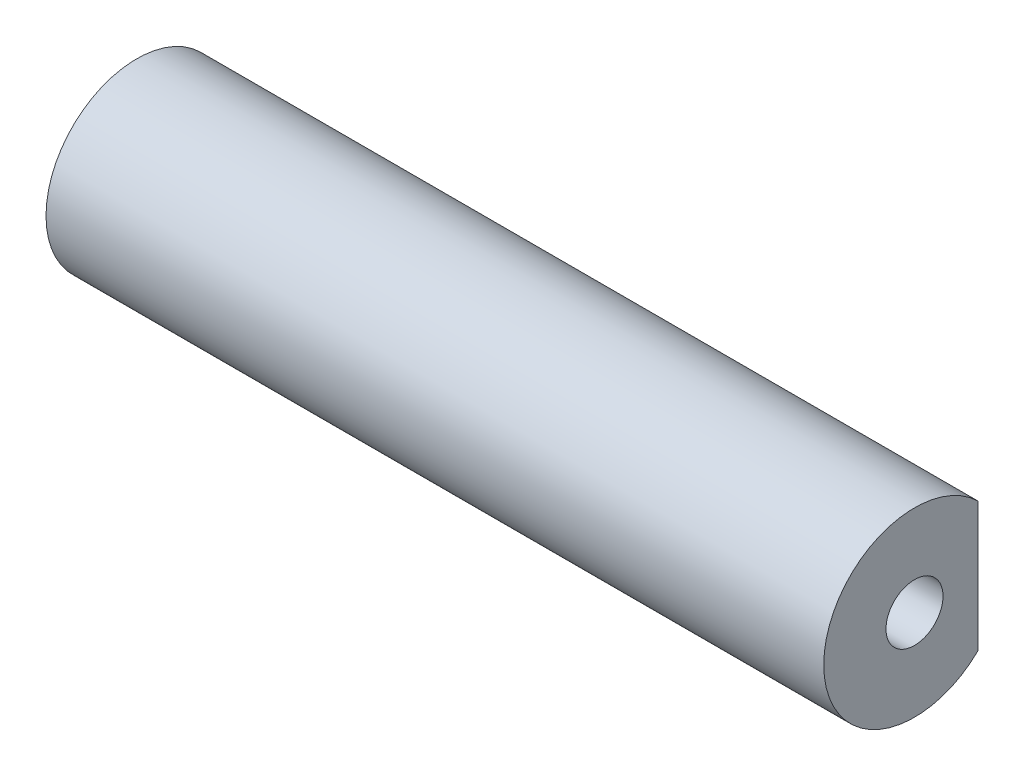
ISO-10303-21;
HEADER;
FILE_DESCRIPTION(('STEP AP214'),'2;1');
FILE_NAME('part.step','',(''),(''),'','','');
FILE_SCHEMA(('AUTOMOTIVE_DESIGN { 1 0 10303 214 1 1 1 1 }'));
ENDSEC;
DATA;
#1=APPLICATION_CONTEXT('core data for automotive mechanical design processes');
#2=APPLICATION_PROTOCOL_DEFINITION('international standard','automotive_design',2000,#1);
#3=PRODUCT_CONTEXT('',#1,'mechanical');
#4=PRODUCT('Part','Part','',(#3));
#5=PRODUCT_RELATED_PRODUCT_CATEGORY('part','',(#4));
#6=PRODUCT_DEFINITION_FORMATION('','',#4);
#7=PRODUCT_DEFINITION_CONTEXT('part definition',#1,'design');
#8=PRODUCT_DEFINITION('design','',#6,#7);
#9=PRODUCT_DEFINITION_SHAPE('','',#8);
#10=(LENGTH_UNIT() NAMED_UNIT(*) SI_UNIT(.MILLI.,.METRE.));
#11=(NAMED_UNIT(*) PLANE_ANGLE_UNIT() SI_UNIT($,.RADIAN.));
#12=(NAMED_UNIT(*) SI_UNIT($,.STERADIAN.) SOLID_ANGLE_UNIT());
#13=UNCERTAINTY_MEASURE_WITH_UNIT(LENGTH_MEASURE(1.E-05),#10,'distance_accuracy_value','');
#14=(GEOMETRIC_REPRESENTATION_CONTEXT(3) GLOBAL_UNCERTAINTY_ASSIGNED_CONTEXT((#13)) GLOBAL_UNIT_ASSIGNED_CONTEXT((#10,
#11,#12)) REPRESENTATION_CONTEXT('',''));
#15=CARTESIAN_POINT('',(0.,0.,0.));
#16=DIRECTION('',(0.,0.,1.));
#17=DIRECTION('',(1.,0.,0.));
#18=AXIS2_PLACEMENT_3D('',#15,#16,#17);
#19=CARTESIAN_POINT('',(30.,0.,0.));
#20=DIRECTION('',(-1.,0.,0.));
#21=DIRECTION('',(0.,0.,1.));
#22=AXIS2_PLACEMENT_3D('',#19,#20,#21);
#23=CYLINDRICAL_SURFACE('',#22,3.5);
#24=CARTESIAN_POINT('',(30.,0.,0.));
#25=DIRECTION('',(1.,0.,0.));
#26=DIRECTION('',(0.,0.,-1.));
#27=AXIS2_PLACEMENT_3D('',#24,#25,#26);
#28=CIRCLE('',#27,3.5);
#29=CARTESIAN_POINT('',(30.,2.5,-2.44948974278318));
#30=VERTEX_POINT('',#29);
#31=CARTESIAN_POINT('',(30.,-2.5,-2.44948974278318));
#32=VERTEX_POINT('',#31);
#33=EDGE_CURVE('E11',#30,#32,#28,.T.);
#34=ORIENTED_EDGE('',*,*,#33,.F.);
#35=DIRECTION('',(1.,0.,0.));
#36=VECTOR('',#35,1.);
#37=CARTESIAN_POINT('',(-5.10916547006629,2.5,-2.44948974278318));
#38=LINE('',#37,#36);
#39=CARTESIAN_POINT('',(0.,2.5,-2.44948974278318));
#40=VERTEX_POINT('',#39);
#41=EDGE_CURVE('E56',#40,#30,#38,.T.);
#42=ORIENTED_EDGE('',*,*,#41,.F.);
#43=CARTESIAN_POINT('',(0.,0.,0.));
#44=DIRECTION('',(1.,0.,0.));
#45=DIRECTION('',(0.,0.,-1.));
#46=AXIS2_PLACEMENT_3D('',#43,#44,#45);
#47=CIRCLE('',#46,3.5);
#48=CARTESIAN_POINT('',(0.,-2.5,-2.44948974278318));
#49=VERTEX_POINT('',#48);
#50=EDGE_CURVE('E36',#40,#49,#47,.T.);
#51=ORIENTED_EDGE('',*,*,#50,.T.);
#52=DIRECTION('',(1.,0.,0.));
#53=VECTOR('',#52,1.);
#54=CARTESIAN_POINT('',(-5.10916547006629,-2.5,-2.44948974278318));
#55=LINE('',#54,#53);
#56=EDGE_CURVE('E47',#49,#32,#55,.T.);
#57=ORIENTED_EDGE('',*,*,#56,.T.);
#58=EDGE_LOOP('',(#34,#42,#51,#57));
#59=FACE_BOUND('',#58,.T.);
#60=ADVANCED_FACE('F33',(#59),#23,.T.);
#61=CARTESIAN_POINT('',(30.,0.,0.));
#62=DIRECTION('',(1.,0.,0.));
#63=DIRECTION('',(0.,0.,-1.));
#64=AXIS2_PLACEMENT_3D('',#61,#62,#63);
#65=PLANE('',#64);
#66=DIRECTION('',(0.,-1.,0.));
#67=VECTOR('',#66,1.);
#68=CARTESIAN_POINT('',(30.,2.5,-2.44948974278318));
#69=LINE('',#68,#67);
#70=EDGE_CURVE('E59',#30,#32,#69,.T.);
#71=ORIENTED_EDGE('',*,*,#70,.F.);
#72=ORIENTED_EDGE('',*,*,#33,.T.);
#73=EDGE_LOOP('',(#71,#72));
#74=FACE_BOUND('',#73,.T.);
#75=CARTESIAN_POINT('',(30.,0.,0.));
#76=DIRECTION('',(1.,0.,0.));
#77=DIRECTION('',(0.,0.,-1.));
#78=AXIS2_PLACEMENT_3D('',#75,#76,#77);
#79=CIRCLE('',#78,1.1);
#80=CARTESIAN_POINT('',(30.,0.,-1.1));
#81=VERTEX_POINT('',#80);
#82=EDGE_CURVE('E70',#81,#81,#79,.T.);
#83=ORIENTED_EDGE('',*,*,#82,.F.);
#84=EDGE_LOOP('',(#83));
#85=FACE_BOUND('',#84,.T.);
#86=ADVANCED_FACE('F66',(#74,#85),#65,.T.);
#87=CARTESIAN_POINT('',(0.,0.,0.));
#88=DIRECTION('',(1.,0.,0.));
#89=DIRECTION('',(0.,0.,-1.));
#90=AXIS2_PLACEMENT_3D('',#87,#88,#89);
#91=PLANE('',#90);
#92=CARTESIAN_POINT('',(0.,0.,0.));
#93=DIRECTION('',(-1.,0.,0.));
#94=DIRECTION('',(0.,0.,1.));
#95=AXIS2_PLACEMENT_3D('',#92,#93,#94);
#96=CIRCLE('',#95,1.2);
#97=CARTESIAN_POINT('',(0.,0.,1.2));
#98=VERTEX_POINT('',#97);
#99=EDGE_CURVE('E76',#98,#98,#96,.T.);
#100=ORIENTED_EDGE('',*,*,#99,.F.);
#101=EDGE_LOOP('',(#100));
#102=FACE_BOUND('',#101,.T.);
#103=ORIENTED_EDGE('',*,*,#50,.F.);
#104=DIRECTION('',(0.,1.,0.));
#105=VECTOR('',#104,1.);
#106=CARTESIAN_POINT('',(0.,2.5,-2.44948974278318));
#107=LINE('',#106,#105);
#108=EDGE_CURVE('E51',#49,#40,#107,.T.);
#109=ORIENTED_EDGE('',*,*,#108,.F.);
#110=EDGE_LOOP('',(#103,#109));
#111=FACE_BOUND('',#110,.T.);
#112=ADVANCED_FACE('F87',(#102,#111),#91,.F.);
#113=CARTESIAN_POINT('',(15.,0.,0.));
#114=DIRECTION('',(-1.,0.,0.));
#115=DIRECTION('',(0.,0.,1.));
#116=AXIS2_PLACEMENT_3D('',#113,#114,#115);
#117=CYLINDRICAL_SURFACE('',#116,1.2);
#118=CARTESIAN_POINT('',(15.,0.,0.));
#119=DIRECTION('',(-1.,0.,0.));
#120=DIRECTION('',(0.,0.,1.));
#121=AXIS2_PLACEMENT_3D('',#118,#119,#120);
#122=CIRCLE('',#121,1.2);
#123=CARTESIAN_POINT('',(15.,0.,1.2));
#124=VERTEX_POINT('',#123);
#125=EDGE_CURVE('E79',#124,#124,#122,.T.);
#126=ORIENTED_EDGE('',*,*,#125,.F.);
#127=EDGE_LOOP('',(#126));
#128=FACE_BOUND('',#127,.T.);
#129=ORIENTED_EDGE('',*,*,#99,.T.);
#130=EDGE_LOOP('',(#129));
#131=FACE_BOUND('',#130,.T.);
#132=ADVANCED_FACE('F85',(#128,#131),#117,.F.);
#133=CARTESIAN_POINT('',(15.,0.,0.));
#134=DIRECTION('',(-1.,0.,0.));
#135=DIRECTION('',(0.,0.,1.));
#136=AXIS2_PLACEMENT_3D('',#133,#134,#135);
#137=PLANE('',#136);
#138=CARTESIAN_POINT('',(15.,0.,0.));
#139=DIRECTION('',(1.,0.,0.));
#140=DIRECTION('',(0.,0.,-1.));
#141=AXIS2_PLACEMENT_3D('',#138,#139,#140);
#142=CIRCLE('',#141,1.1);
#143=CARTESIAN_POINT('',(15.,0.,-1.1));
#144=VERTEX_POINT('',#143);
#145=EDGE_CURVE('E73',#144,#144,#142,.T.);
#146=ORIENTED_EDGE('',*,*,#145,.T.);
#147=EDGE_LOOP('',(#146));
#148=FACE_BOUND('',#147,.T.);
#149=ORIENTED_EDGE('',*,*,#125,.T.);
#150=EDGE_LOOP('',(#149));
#151=FACE_BOUND('',#150,.T.);
#152=ADVANCED_FACE('F95',(#148,#151),#137,.T.);
#153=CARTESIAN_POINT('',(15.,0.,0.));
#154=DIRECTION('',(1.,0.,0.));
#155=DIRECTION('',(0.,0.,-1.));
#156=AXIS2_PLACEMENT_3D('',#153,#154,#155);
#157=CYLINDRICAL_SURFACE('',#156,1.1);
#158=ORIENTED_EDGE('',*,*,#145,.F.);
#159=EDGE_LOOP('',(#158));
#160=FACE_BOUND('',#159,.T.);
#161=ORIENTED_EDGE('',*,*,#82,.T.);
#162=EDGE_LOOP('',(#161));
#163=FACE_BOUND('',#162,.T.);
#164=ADVANCED_FACE('F106',(#160,#163),#157,.F.);
#165=CARTESIAN_POINT('',(-5.10916547006629,2.5,-2.44948974278318));
#166=DIRECTION('',(0.,0.,1.));
#167=DIRECTION('',(1.,0.,0.));
#168=AXIS2_PLACEMENT_3D('',#165,#166,#167);
#169=PLANE('',#168);
#170=ORIENTED_EDGE('',*,*,#108,.T.);
#171=ORIENTED_EDGE('',*,*,#41,.T.);
#172=ORIENTED_EDGE('',*,*,#70,.T.);
#173=ORIENTED_EDGE('',*,*,#56,.F.);
#174=EDGE_LOOP('',(#170,#171,#172,#173));
#175=FACE_BOUND('',#174,.T.);
#176=ADVANCED_FACE('F58',(#175),#169,.F.);
#177=CLOSED_SHELL('',(#60,#86,#112,#132,#152,#164,#176));
#178=MANIFOLD_SOLID_BREP('B2',#177);
#179=ADVANCED_BREP_SHAPE_REPRESENTATION('',(#18,#178),#14);
#180=SHAPE_DEFINITION_REPRESENTATION(#9,#179);
ENDSEC;
END-ISO-10303-21;
